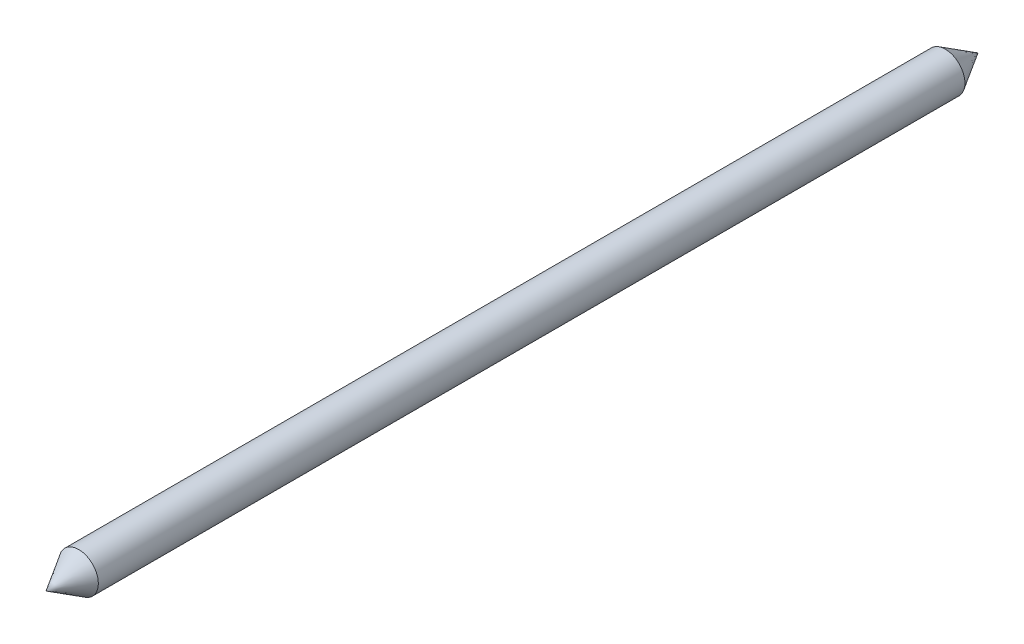
ISO-10303-21;
HEADER;
FILE_DESCRIPTION(('STEP AP214'),'2;1');
FILE_NAME('part.step','',(''),(''),'','','');
FILE_SCHEMA(('AUTOMOTIVE_DESIGN { 1 0 10303 214 1 1 1 1 }'));
ENDSEC;
DATA;
#1=APPLICATION_CONTEXT('core data for automotive mechanical design processes');
#2=APPLICATION_PROTOCOL_DEFINITION('international standard','automotive_design',2000,#1);
#3=PRODUCT_CONTEXT('',#1,'mechanical');
#4=PRODUCT('Part','Part','',(#3));
#5=PRODUCT_RELATED_PRODUCT_CATEGORY('part','',(#4));
#6=PRODUCT_DEFINITION_FORMATION('','',#4);
#7=PRODUCT_DEFINITION_CONTEXT('part definition',#1,'design');
#8=PRODUCT_DEFINITION('design','',#6,#7);
#9=PRODUCT_DEFINITION_SHAPE('','',#8);
#10=(LENGTH_UNIT() NAMED_UNIT(*) SI_UNIT(.MILLI.,.METRE.));
#11=(NAMED_UNIT(*) PLANE_ANGLE_UNIT() SI_UNIT($,.RADIAN.));
#12=(NAMED_UNIT(*) SI_UNIT($,.STERADIAN.) SOLID_ANGLE_UNIT());
#13=UNCERTAINTY_MEASURE_WITH_UNIT(LENGTH_MEASURE(1.E-05),#10,'distance_accuracy_value','');
#14=(GEOMETRIC_REPRESENTATION_CONTEXT(3) GLOBAL_UNCERTAINTY_ASSIGNED_CONTEXT((#13)) GLOBAL_UNIT_ASSIGNED_CONTEXT((#10,
#11,#12)) REPRESENTATION_CONTEXT('',''));
#15=CARTESIAN_POINT('',(0.,0.,0.));
#16=DIRECTION('',(0.,0.,1.));
#17=DIRECTION('',(1.,0.,0.));
#18=AXIS2_PLACEMENT_3D('',#15,#16,#17);
#19=CARTESIAN_POINT('',(0.,0.,-168.275));
#20=DIRECTION('',(0.,0.,1.));
#21=DIRECTION('',(1.,0.,0.));
#22=AXIS2_PLACEMENT_3D('',#19,#20,#21);
#23=CONICAL_SURFACE('',#22,7.62000000000006,0.540419500270588);
#24=CARTESIAN_POINT('',(0.,0.,-180.975));
#25=VERTEX_POINT('',#24);
#26=VERTEX_LOOP('',#25);
#27=FACE_BOUND('',#26,.T.);
#28=CARTESIAN_POINT('',(0.,0.,-168.275));
#29=DIRECTION('',(0.,0.,1.));
#30=DIRECTION('',(1.,0.,0.));
#31=AXIS2_PLACEMENT_3D('',#28,#29,#30);
#32=CIRCLE('',#31,7.62000000000006);
#33=CARTESIAN_POINT('',(7.62,0.,-168.275));
#34=VERTEX_POINT('',#33);
#35=EDGE_CURVE('E11',#34,#34,#32,.T.);
#36=ORIENTED_EDGE('',*,*,#35,.F.);
#37=EDGE_LOOP('',(#36));
#38=FACE_BOUND('',#37,.T.);
#39=ADVANCED_FACE('F45',(#27,#38),#23,.T.);
#40=CARTESIAN_POINT('',(0.,0.,180.975));
#41=DIRECTION('',(0.,0.,1.));
#42=DIRECTION('',(1.,0.,0.));
#43=AXIS2_PLACEMENT_3D('',#40,#41,#42);
#44=CYLINDRICAL_SURFACE('',#43,7.62000000000005);
#45=ORIENTED_EDGE('',*,*,#35,.T.);
#46=EDGE_LOOP('',(#45));
#47=FACE_BOUND('',#46,.T.);
#48=CARTESIAN_POINT('',(0.,0.,168.275));
#49=DIRECTION('',(0.,0.,1.));
#50=DIRECTION('',(1.,0.,0.));
#51=AXIS2_PLACEMENT_3D('',#48,#49,#50);
#52=CIRCLE('',#51,7.62000000000004);
#53=CARTESIAN_POINT('',(7.62000000000004,0.,168.275));
#54=VERTEX_POINT('',#53);
#55=EDGE_CURVE('E53',#54,#54,#52,.T.);
#56=ORIENTED_EDGE('',*,*,#55,.F.);
#57=EDGE_LOOP('',(#56));
#58=FACE_BOUND('',#57,.T.);
#59=ADVANCED_FACE('F61',(#47,#58),#44,.T.);
#60=CARTESIAN_POINT('',(0.,0.,180.975));
#61=DIRECTION('',(0.,0.,-1.));
#62=DIRECTION('',(-1.,0.,0.));
#63=AXIS2_PLACEMENT_3D('',#60,#61,#62);
#64=CONICAL_SURFACE('',#63,0.,0.540419500270587);
#65=ORIENTED_EDGE('',*,*,#55,.T.);
#66=EDGE_LOOP('',(#65));
#67=FACE_BOUND('',#66,.T.);
#68=CARTESIAN_POINT('',(0.,0.,180.975));
#69=VERTEX_POINT('',#68);
#70=VERTEX_LOOP('',#69);
#71=FACE_BOUND('',#70,.T.);
#72=ADVANCED_FACE('F66',(#67,#71),#64,.T.);
#73=CLOSED_SHELL('',(#39,#59,#72));
#74=MANIFOLD_SOLID_BREP('B2',#73);
#75=ADVANCED_BREP_SHAPE_REPRESENTATION('',(#18,#74),#14);
#76=SHAPE_DEFINITION_REPRESENTATION(#9,#75);
ENDSEC;
END-ISO-10303-21;
